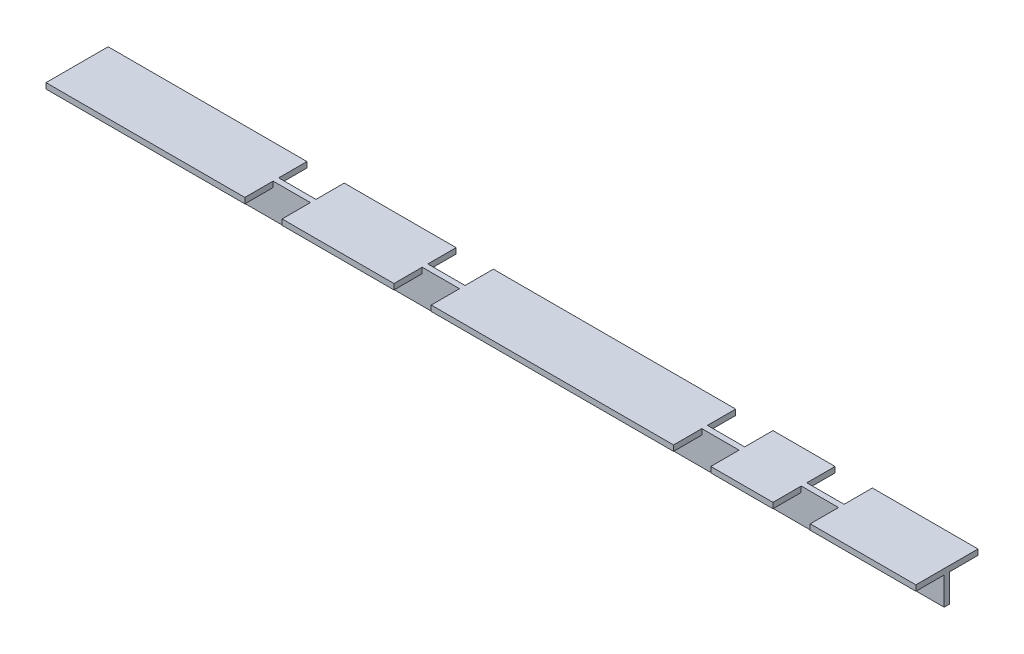
ISO-10303-21;
HEADER;
FILE_DESCRIPTION(('STEP AP214'),'2;1');
FILE_NAME('part.step','',(''),(''),'','','');
FILE_SCHEMA(('AUTOMOTIVE_DESIGN { 1 0 10303 214 1 1 1 1 }'));
ENDSEC;
DATA;
#1=APPLICATION_CONTEXT('core data for automotive mechanical design processes');
#2=APPLICATION_PROTOCOL_DEFINITION('international standard','automotive_design',2000,#1);
#3=PRODUCT_CONTEXT('',#1,'mechanical');
#4=PRODUCT('Part','Part','',(#3));
#5=PRODUCT_RELATED_PRODUCT_CATEGORY('part','',(#4));
#6=PRODUCT_DEFINITION_FORMATION('','',#4);
#7=PRODUCT_DEFINITION_CONTEXT('part definition',#1,'design');
#8=PRODUCT_DEFINITION('design','',#6,#7);
#9=PRODUCT_DEFINITION_SHAPE('','',#8);
#10=(LENGTH_UNIT() NAMED_UNIT(*) SI_UNIT(.MILLI.,.METRE.));
#11=(NAMED_UNIT(*) PLANE_ANGLE_UNIT() SI_UNIT($,.RADIAN.));
#12=(NAMED_UNIT(*) SI_UNIT($,.STERADIAN.) SOLID_ANGLE_UNIT());
#13=UNCERTAINTY_MEASURE_WITH_UNIT(LENGTH_MEASURE(1.E-05),#10,'distance_accuracy_value','');
#14=(GEOMETRIC_REPRESENTATION_CONTEXT(3) GLOBAL_UNCERTAINTY_ASSIGNED_CONTEXT((#13)) GLOBAL_UNIT_ASSIGNED_CONTEXT((#10,
#11,#12)) REPRESENTATION_CONTEXT('',''));
#15=CARTESIAN_POINT('',(0.,0.,0.));
#16=DIRECTION('',(0.,0.,1.));
#17=DIRECTION('',(1.,0.,0.));
#18=AXIS2_PLACEMENT_3D('',#15,#16,#17);
#19=CARTESIAN_POINT('',(1400.,0.,0.));
#20=DIRECTION('',(0.,0.,-1.));
#21=DIRECTION('',(-1.,0.,0.));
#22=AXIS2_PLACEMENT_3D('',#19,#20,#21);
#23=PLANE('',#22);
#24=DIRECTION('',(-1.,0.,0.));
#25=VECTOR('',#24,1.);
#26=CARTESIAN_POINT('',(1400.,0.,0.));
#27=LINE('',#26,#25);
#28=CARTESIAN_POINT('',(1010.,0.,0.));
#29=VERTEX_POINT('',#28);
#30=CARTESIAN_POINT('',(620.,0.,0.));
#31=VERTEX_POINT('',#30);
#32=EDGE_CURVE('E686',#29,#31,#27,.T.);
#33=ORIENTED_EDGE('',*,*,#32,.T.);
#34=DIRECTION('',(0.,-1.,0.));
#35=VECTOR('',#34,1.);
#36=CARTESIAN_POINT('',(620.,0.,0.));
#37=LINE('',#36,#35);
#38=CARTESIAN_POINT('',(620.,-9.,0.));
#39=VERTEX_POINT('',#38);
#40=EDGE_CURVE('E422',#31,#39,#37,.T.);
#41=ORIENTED_EDGE('',*,*,#40,.T.);
#42=DIRECTION('',(-1.,0.,0.));
#43=VECTOR('',#42,1.);
#44=CARTESIAN_POINT('',(1400.,-9.,0.));
#45=LINE('',#44,#43);
#46=CARTESIAN_POINT('',(1010.,-9.,0.));
#47=VERTEX_POINT('',#46);
#48=EDGE_CURVE('E679',#47,#39,#45,.T.);
#49=ORIENTED_EDGE('',*,*,#48,.F.);
#50=DIRECTION('',(0.,-1.,0.));
#51=VECTOR('',#50,1.);
#52=CARTESIAN_POINT('',(1010.,0.,0.));
#53=LINE('',#52,#51);
#54=EDGE_CURVE('E405',#29,#47,#53,.T.);
#55=ORIENTED_EDGE('',*,*,#54,.F.);
#56=EDGE_LOOP('',(#33,#41,#49,#55));
#57=FACE_BOUND('',#56,.T.);
#58=ADVANCED_FACE('F40',(#57),#23,.F.);
#59=CARTESIAN_POINT('',(1400.,0.,0.));
#60=VERTEX_POINT('',#59);
#61=CARTESIAN_POINT('',(1230.,0.,0.));
#62=VERTEX_POINT('',#61);
#63=EDGE_CURVE('E620',#60,#62,#27,.T.);
#64=ORIENTED_EDGE('',*,*,#63,.T.);
#65=DIRECTION('',(0.,-1.,0.));
#66=VECTOR('',#65,1.);
#67=CARTESIAN_POINT('',(1230.,0.,0.));
#68=LINE('',#67,#66);
#69=CARTESIAN_POINT('',(1230.,-9.,0.));
#70=VERTEX_POINT('',#69);
#71=EDGE_CURVE('E454',#62,#70,#68,.T.);
#72=ORIENTED_EDGE('',*,*,#71,.T.);
#73=CARTESIAN_POINT('',(1400.,-9.,0.));
#74=VERTEX_POINT('',#73);
#75=EDGE_CURVE('E11',#74,#70,#45,.T.);
#76=ORIENTED_EDGE('',*,*,#75,.F.);
#77=DIRECTION('',(0.,-1.,0.));
#78=VECTOR('',#77,1.);
#79=CARTESIAN_POINT('',(1400.,0.,0.));
#80=LINE('',#79,#78);
#81=EDGE_CURVE('E566',#60,#74,#80,.T.);
#82=ORIENTED_EDGE('',*,*,#81,.F.);
#83=EDGE_LOOP('',(#64,#72,#76,#82));
#84=FACE_BOUND('',#83,.T.);
#85=ADVANCED_FACE('F757',(#84),#23,.F.);
#86=CARTESIAN_POINT('',(1170.,-9.,0.));
#87=VERTEX_POINT('',#86);
#88=CARTESIAN_POINT('',(1070.,-9.,0.));
#89=VERTEX_POINT('',#88);
#90=EDGE_CURVE('E49',#87,#89,#45,.T.);
#91=ORIENTED_EDGE('',*,*,#90,.F.);
#92=DIRECTION('',(0.,-1.,0.));
#93=VECTOR('',#92,1.);
#94=CARTESIAN_POINT('',(1170.,0.,0.));
#95=LINE('',#94,#93);
#96=CARTESIAN_POINT('',(1170.,0.,0.));
#97=VERTEX_POINT('',#96);
#98=EDGE_CURVE('E467',#97,#87,#95,.T.);
#99=ORIENTED_EDGE('',*,*,#98,.F.);
#100=CARTESIAN_POINT('',(1070.,0.,0.));
#101=VERTEX_POINT('',#100);
#102=EDGE_CURVE('E625',#97,#101,#27,.T.);
#103=ORIENTED_EDGE('',*,*,#102,.T.);
#104=DIRECTION('',(0.,-1.,0.));
#105=VECTOR('',#104,1.);
#106=CARTESIAN_POINT('',(1070.,0.,0.));
#107=LINE('',#106,#105);
#108=EDGE_CURVE('E394',#101,#89,#107,.T.);
#109=ORIENTED_EDGE('',*,*,#108,.T.);
#110=EDGE_LOOP('',(#91,#99,#103,#109));
#111=FACE_BOUND('',#110,.T.);
#112=ADVANCED_FACE('F738',(#111),#23,.F.);
#113=CARTESIAN_POINT('',(560.,-9.,0.));
#114=VERTEX_POINT('',#113);
#115=CARTESIAN_POINT('',(380.,-9.,0.));
#116=VERTEX_POINT('',#115);
#117=EDGE_CURVE('E658',#114,#116,#45,.T.);
#118=ORIENTED_EDGE('',*,*,#117,.F.);
#119=DIRECTION('',(0.,-1.,0.));
#120=VECTOR('',#119,1.);
#121=CARTESIAN_POINT('',(560.,0.,0.));
#122=LINE('',#121,#120);
#123=CARTESIAN_POINT('',(560.,0.,0.));
#124=VERTEX_POINT('',#123);
#125=EDGE_CURVE('E437',#124,#114,#122,.T.);
#126=ORIENTED_EDGE('',*,*,#125,.F.);
#127=CARTESIAN_POINT('',(380.,0.,0.));
#128=VERTEX_POINT('',#127);
#129=EDGE_CURVE('E688',#124,#128,#27,.T.);
#130=ORIENTED_EDGE('',*,*,#129,.T.);
#131=DIRECTION('',(0.,-1.,0.));
#132=VECTOR('',#131,1.);
#133=CARTESIAN_POINT('',(380.,0.,0.));
#134=LINE('',#133,#132);
#135=EDGE_CURVE('E547',#128,#116,#134,.T.);
#136=ORIENTED_EDGE('',*,*,#135,.T.);
#137=EDGE_LOOP('',(#118,#126,#130,#136));
#138=FACE_BOUND('',#137,.T.);
#139=ADVANCED_FACE('F722',(#138),#23,.F.);
#140=CARTESIAN_POINT('',(1400.,-9.,0.));
#141=DIRECTION('',(0.,1.,0.));
#142=DIRECTION('',(0.,0.,1.));
#143=AXIS2_PLACEMENT_3D('',#140,#141,#142);
#144=PLANE('',#143);
#145=ORIENTED_EDGE('',*,*,#48,.T.);
#146=DIRECTION('',(0.,0.,1.));
#147=VECTOR('',#146,1.);
#148=CARTESIAN_POINT('',(620.,-8.99999999999998,-45.5));
#149=LINE('',#148,#147);
#150=CARTESIAN_POINT('',(620.,-8.99999999999998,-45.5));
#151=VERTEX_POINT('',#150);
#152=EDGE_CURVE('E423',#151,#39,#149,.T.);
#153=ORIENTED_EDGE('',*,*,#152,.F.);
#154=DIRECTION('',(-1.,0.,0.));
#155=VECTOR('',#154,1.);
#156=CARTESIAN_POINT('',(1400.,-8.99999999999998,-45.5));
#157=LINE('',#156,#155);
#158=CARTESIAN_POINT('',(1010.,-8.99999999999998,-45.5));
#159=VERTEX_POINT('',#158);
#160=EDGE_CURVE('E660',#159,#151,#157,.T.);
#161=ORIENTED_EDGE('',*,*,#160,.F.);
#162=DIRECTION('',(0.,0.,-1.));
#163=VECTOR('',#162,1.);
#164=CARTESIAN_POINT('',(1010.,-9.,0.));
#165=LINE('',#164,#163);
#166=EDGE_CURVE('E386',#47,#159,#165,.T.);
#167=ORIENTED_EDGE('',*,*,#166,.F.);
#168=EDGE_LOOP('',(#145,#153,#161,#167));
#169=FACE_BOUND('',#168,.T.);
#170=ADVANCED_FACE('F677',(#169),#144,.F.);
#171=ORIENTED_EDGE('',*,*,#75,.T.);
#172=DIRECTION('',(0.,0.,1.));
#173=VECTOR('',#172,1.);
#174=CARTESIAN_POINT('',(1230.,-8.99999999999998,-45.5));
#175=LINE('',#174,#173);
#176=CARTESIAN_POINT('',(1230.,-8.99999999999998,-45.5));
#177=VERTEX_POINT('',#176);
#178=EDGE_CURVE('E455',#177,#70,#175,.T.);
#179=ORIENTED_EDGE('',*,*,#178,.F.);
#180=CARTESIAN_POINT('',(1400.,-8.99999999999998,-45.5));
#181=VERTEX_POINT('',#180);
#182=EDGE_CURVE('E650',#181,#177,#157,.T.);
#183=ORIENTED_EDGE('',*,*,#182,.F.);
#184=DIRECTION('',(0.,0.,-1.));
#185=VECTOR('',#184,1.);
#186=CARTESIAN_POINT('',(1400.,-9.,0.));
#187=LINE('',#186,#185);
#188=EDGE_CURVE('E570',#74,#181,#187,.T.);
#189=ORIENTED_EDGE('',*,*,#188,.F.);
#190=EDGE_LOOP('',(#171,#179,#183,#189));
#191=FACE_BOUND('',#190,.T.);
#192=ADVANCED_FACE('F778',(#191),#144,.F.);
#193=CARTESIAN_POINT('',(1170.,-8.99999999999998,-45.5));
#194=VERTEX_POINT('',#193);
#195=CARTESIAN_POINT('',(1070.,-8.99999999999998,-45.5));
#196=VERTEX_POINT('',#195);
#197=EDGE_CURVE('E653',#194,#196,#157,.T.);
#198=ORIENTED_EDGE('',*,*,#197,.F.);
#199=DIRECTION('',(0.,0.,-1.));
#200=VECTOR('',#199,1.);
#201=CARTESIAN_POINT('',(1170.,-8.99999999999998,-45.5));
#202=LINE('',#201,#200);
#203=EDGE_CURVE('E448',#87,#194,#202,.T.);
#204=ORIENTED_EDGE('',*,*,#203,.F.);
#205=ORIENTED_EDGE('',*,*,#90,.T.);
#206=DIRECTION('',(0.,0.,1.));
#207=VECTOR('',#206,1.);
#208=CARTESIAN_POINT('',(1070.,-9.,0.));
#209=LINE('',#208,#207);
#210=EDGE_CURVE('E340',#196,#89,#209,.T.);
#211=ORIENTED_EDGE('',*,*,#210,.F.);
#212=EDGE_LOOP('',(#198,#204,#205,#211));
#213=FACE_BOUND('',#212,.T.);
#214=ADVANCED_FACE('F735',(#213),#144,.F.);
#215=CARTESIAN_POINT('',(560.,-8.99999999999998,-45.5));
#216=VERTEX_POINT('',#215);
#217=CARTESIAN_POINT('',(380.,-8.99999999999998,-45.5));
#218=VERTEX_POINT('',#217);
#219=EDGE_CURVE('E662',#216,#218,#157,.T.);
#220=ORIENTED_EDGE('',*,*,#219,.F.);
#221=DIRECTION('',(0.,0.,-1.));
#222=VECTOR('',#221,1.);
#223=CARTESIAN_POINT('',(560.,-8.99999999999998,-45.5));
#224=LINE('',#223,#222);
#225=EDGE_CURVE('E416',#114,#216,#224,.T.);
#226=ORIENTED_EDGE('',*,*,#225,.F.);
#227=ORIENTED_EDGE('',*,*,#117,.T.);
#228=DIRECTION('',(0.,0.,1.));
#229=VECTOR('',#228,1.);
#230=CARTESIAN_POINT('',(380.,-8.99999999999998,-45.5));
#231=LINE('',#230,#229);
#232=EDGE_CURVE('E433',#218,#116,#231,.T.);
#233=ORIENTED_EDGE('',*,*,#232,.F.);
#234=EDGE_LOOP('',(#220,#226,#227,#233));
#235=FACE_BOUND('',#234,.T.);
#236=ADVANCED_FACE('F725',(#235),#144,.F.);
#237=CARTESIAN_POINT('',(1400.,-8.99999999999998,-54.5));
#238=DIRECTION('',(0.,1.,0.));
#239=DIRECTION('',(0.,0.,1.));
#240=AXIS2_PLACEMENT_3D('',#237,#238,#239);
#241=PLANE('',#240);
#242=DIRECTION('',(-1.,0.,0.));
#243=VECTOR('',#242,1.);
#244=CARTESIAN_POINT('',(1400.,-8.99999999999998,-54.5));
#245=LINE('',#244,#243);
#246=CARTESIAN_POINT('',(1400.,-8.99999999999998,-54.5));
#247=VERTEX_POINT('',#246);
#248=CARTESIAN_POINT('',(1230.,-8.99999999999998,-54.5));
#249=VERTEX_POINT('',#248);
#250=EDGE_CURVE('E637',#247,#249,#245,.T.);
#251=ORIENTED_EDGE('',*,*,#250,.T.);
#252=DIRECTION('',(0.,0.,1.));
#253=VECTOR('',#252,1.);
#254=CARTESIAN_POINT('',(1230.,-8.99999999999996,-100.));
#255=LINE('',#254,#253);
#256=CARTESIAN_POINT('',(1230.,-8.99999999999996,-100.));
#257=VERTEX_POINT('',#256);
#258=EDGE_CURVE('E486',#257,#249,#255,.T.);
#259=ORIENTED_EDGE('',*,*,#258,.F.);
#260=DIRECTION('',(-1.,0.,0.));
#261=VECTOR('',#260,1.);
#262=CARTESIAN_POINT('',(1400.,-8.99999999999998,-100.));
#263=LINE('',#262,#261);
#264=CARTESIAN_POINT('',(1400.,-8.99999999999998,-100.));
#265=VERTEX_POINT('',#264);
#266=EDGE_CURVE('E631',#265,#257,#263,.T.);
#267=ORIENTED_EDGE('',*,*,#266,.F.);
#268=DIRECTION('',(0.,0.,-1.));
#269=VECTOR('',#268,1.);
#270=CARTESIAN_POINT('',(1400.,-8.99999999999998,-54.5));
#271=LINE('',#270,#269);
#272=EDGE_CURVE('E583',#247,#265,#271,.T.);
#273=ORIENTED_EDGE('',*,*,#272,.F.);
#274=EDGE_LOOP('',(#251,#259,#267,#273));
#275=FACE_BOUND('',#274,.T.);
#276=ADVANCED_FACE('F985',(#275),#241,.F.);
#277=CARTESIAN_POINT('',(1010.,-8.99999999999998,-54.5000000000002));
#278=VERTEX_POINT('',#277);
#279=CARTESIAN_POINT('',(620.,-8.99999999999998,-54.5000000000004));
#280=VERTEX_POINT('',#279);
#281=EDGE_CURVE('E1009',#278,#280,#245,.T.);
#282=ORIENTED_EDGE('',*,*,#281,.T.);
#283=DIRECTION('',(0.,0.,1.));
#284=VECTOR('',#283,1.);
#285=CARTESIAN_POINT('',(620.,-8.99999999999996,-100.));
#286=LINE('',#285,#284);
#287=CARTESIAN_POINT('',(620.,-8.99999999999996,-100.));
#288=VERTEX_POINT('',#287);
#289=EDGE_CURVE('E371',#288,#280,#286,.T.);
#290=ORIENTED_EDGE('',*,*,#289,.F.);
#291=CARTESIAN_POINT('',(1010.,-8.99999999999996,-100.));
#292=VERTEX_POINT('',#291);
#293=EDGE_CURVE('E1071',#292,#288,#263,.T.);
#294=ORIENTED_EDGE('',*,*,#293,.F.);
#295=DIRECTION('',(0.,0.,-1.));
#296=VECTOR('',#295,1.);
#297=CARTESIAN_POINT('',(1010.,-8.99999999999998,-54.5000000000002));
#298=LINE('',#297,#296);
#299=EDGE_CURVE('E328',#278,#292,#298,.T.);
#300=ORIENTED_EDGE('',*,*,#299,.F.);
#301=EDGE_LOOP('',(#282,#290,#294,#300));
#302=FACE_BOUND('',#301,.T.);
#303=ADVANCED_FACE('F1052',(#302),#241,.F.);
#304=CARTESIAN_POINT('',(1170.,-8.99999999999996,-100.));
#305=VERTEX_POINT('',#304);
#306=CARTESIAN_POINT('',(1070.,-8.99999999999996,-100.));
#307=VERTEX_POINT('',#306);
#308=EDGE_CURVE('E636',#305,#307,#263,.T.);
#309=ORIENTED_EDGE('',*,*,#308,.F.);
#310=DIRECTION('',(0.,0.,-1.));
#311=VECTOR('',#310,1.);
#312=CARTESIAN_POINT('',(1170.,-8.99999999999996,-100.));
#313=LINE('',#312,#311);
#314=CARTESIAN_POINT('',(1170.,-8.99999999999998,-54.5));
#315=VERTEX_POINT('',#314);
#316=EDGE_CURVE('E478',#315,#305,#313,.T.);
#317=ORIENTED_EDGE('',*,*,#316,.F.);
#318=CARTESIAN_POINT('',(1070.,-8.99999999999998,-54.5));
#319=VERTEX_POINT('',#318);
#320=EDGE_CURVE('E642',#315,#319,#245,.T.);
#321=ORIENTED_EDGE('',*,*,#320,.T.);
#322=DIRECTION('',(0.,0.,1.));
#323=VECTOR('',#322,1.);
#324=CARTESIAN_POINT('',(1070.,-8.99999999999998,-54.5));
#325=LINE('',#324,#323);
#326=EDGE_CURVE('E304',#307,#319,#325,.T.);
#327=ORIENTED_EDGE('',*,*,#326,.F.);
#328=EDGE_LOOP('',(#309,#317,#321,#327));
#329=FACE_BOUND('',#328,.T.);
#330=ADVANCED_FACE('F1023',(#329),#241,.F.);
#331=CARTESIAN_POINT('',(560.,-8.99999999999996,-100.));
#332=VERTEX_POINT('',#331);
#333=CARTESIAN_POINT('',(380.,-8.99999999999996,-100.));
#334=VERTEX_POINT('',#333);
#335=EDGE_CURVE('E1068',#332,#334,#263,.T.);
#336=ORIENTED_EDGE('',*,*,#335,.F.);
#337=DIRECTION('',(0.,0.,-1.));
#338=VECTOR('',#337,1.);
#339=CARTESIAN_POINT('',(560.,-8.99999999999996,-100.));
#340=LINE('',#339,#338);
#341=CARTESIAN_POINT('',(560.,-8.99999999999998,-54.5));
#342=VERTEX_POINT('',#341);
#343=EDGE_CURVE('E509',#342,#332,#340,.T.);
#344=ORIENTED_EDGE('',*,*,#343,.F.);
#345=CARTESIAN_POINT('',(380.,-8.99999999999998,-54.5000000000006));
#346=VERTEX_POINT('',#345);
#347=EDGE_CURVE('E1006',#342,#346,#245,.T.);
#348=ORIENTED_EDGE('',*,*,#347,.T.);
#349=DIRECTION('',(0.,0.,1.));
#350=VECTOR('',#349,1.);
#351=CARTESIAN_POINT('',(380.,-8.99999999999996,-100.));
#352=LINE('',#351,#350);
#353=EDGE_CURVE('E361',#334,#346,#352,.T.);
#354=ORIENTED_EDGE('',*,*,#353,.F.);
#355=EDGE_LOOP('',(#336,#344,#348,#354));
#356=FACE_BOUND('',#355,.T.);
#357=ADVANCED_FACE('F986',(#356),#241,.F.);
#358=CARTESIAN_POINT('',(1400.,0.,-100.));
#359=DIRECTION('',(0.,0.,1.));
#360=DIRECTION('',(1.,0.,0.));
#361=AXIS2_PLACEMENT_3D('',#358,#359,#360);
#362=PLANE('',#361);
#363=ORIENTED_EDGE('',*,*,#266,.T.);
#364=DIRECTION('',(0.,-1.,0.));
#365=VECTOR('',#364,1.);
#366=CARTESIAN_POINT('',(1230.,0.,-100.));
#367=LINE('',#366,#365);
#368=CARTESIAN_POINT('',(1230.,0.,-100.));
#369=VERTEX_POINT('',#368);
#370=EDGE_CURVE('E458',#369,#257,#367,.T.);
#371=ORIENTED_EDGE('',*,*,#370,.F.);
#372=DIRECTION('',(-1.,0.,0.));
#373=VECTOR('',#372,1.);
#374=CARTESIAN_POINT('',(1400.,0.,-100.));
#375=LINE('',#374,#373);
#376=CARTESIAN_POINT('',(1400.,0.,-100.));
#377=VERTEX_POINT('',#376);
#378=EDGE_CURVE('E626',#377,#369,#375,.T.);
#379=ORIENTED_EDGE('',*,*,#378,.F.);
#380=DIRECTION('',(0.,1.,0.));
#381=VECTOR('',#380,1.);
#382=CARTESIAN_POINT('',(1400.,0.,-100.));
#383=LINE('',#382,#381);
#384=EDGE_CURVE('E586',#265,#377,#383,.T.);
#385=ORIENTED_EDGE('',*,*,#384,.F.);
#386=EDGE_LOOP('',(#363,#371,#379,#385));
#387=FACE_BOUND('',#386,.T.);
#388=ADVANCED_FACE('F983',(#387),#362,.F.);
#389=ORIENTED_EDGE('',*,*,#293,.T.);
#390=DIRECTION('',(0.,-1.,0.));
#391=VECTOR('',#390,1.);
#392=CARTESIAN_POINT('',(620.,0.,-100.));
#393=LINE('',#392,#391);
#394=CARTESIAN_POINT('',(620.,0.,-100.));
#395=VERTEX_POINT('',#394);
#396=EDGE_CURVE('E490',#395,#288,#393,.T.);
#397=ORIENTED_EDGE('',*,*,#396,.F.);
#398=CARTESIAN_POINT('',(1010.,0.,-100.));
#399=VERTEX_POINT('',#398);
#400=EDGE_CURVE('E1081',#399,#395,#375,.T.);
#401=ORIENTED_EDGE('',*,*,#400,.F.);
#402=DIRECTION('',(0.,-1.,0.));
#403=VECTOR('',#402,1.);
#404=CARTESIAN_POINT('',(1010.,0.,-100.));
#405=LINE('',#404,#403);
#406=EDGE_CURVE('E341',#399,#292,#405,.T.);
#407=ORIENTED_EDGE('',*,*,#406,.T.);
#408=EDGE_LOOP('',(#389,#397,#401,#407));
#409=FACE_BOUND('',#408,.T.);
#410=ADVANCED_FACE('F1065',(#409),#362,.F.);
#411=CARTESIAN_POINT('',(1170.,0.,-100.));
#412=VERTEX_POINT('',#411);
#413=CARTESIAN_POINT('',(1070.,0.,-100.));
#414=VERTEX_POINT('',#413);
#415=EDGE_CURVE('E326',#412,#414,#375,.T.);
#416=ORIENTED_EDGE('',*,*,#415,.F.);
#417=DIRECTION('',(0.,-1.,0.));
#418=VECTOR('',#417,1.);
#419=CARTESIAN_POINT('',(1170.,0.,-100.));
#420=LINE('',#419,#418);
#421=EDGE_CURVE('E495',#412,#305,#420,.T.);
#422=ORIENTED_EDGE('',*,*,#421,.T.);
#423=ORIENTED_EDGE('',*,*,#308,.T.);
#424=DIRECTION('',(0.,-1.,0.));
#425=VECTOR('',#424,1.);
#426=CARTESIAN_POINT('',(1070.,0.,-100.));
#427=LINE('',#426,#425);
#428=EDGE_CURVE('E337',#414,#307,#427,.T.);
#429=ORIENTED_EDGE('',*,*,#428,.F.);
#430=EDGE_LOOP('',(#416,#422,#423,#429));
#431=FACE_BOUND('',#430,.T.);
#432=ADVANCED_FACE('F769',(#431),#362,.F.);
#433=CARTESIAN_POINT('',(560.,0.,-100.));
#434=VERTEX_POINT('',#433);
#435=CARTESIAN_POINT('',(380.,0.,-100.));
#436=VERTEX_POINT('',#435);
#437=EDGE_CURVE('E1079',#434,#436,#375,.T.);
#438=ORIENTED_EDGE('',*,*,#437,.F.);
#439=DIRECTION('',(0.,-1.,0.));
#440=VECTOR('',#439,1.);
#441=CARTESIAN_POINT('',(560.,0.,-100.));
#442=LINE('',#441,#440);
#443=EDGE_CURVE('E525',#434,#332,#442,.T.);
#444=ORIENTED_EDGE('',*,*,#443,.T.);
#445=ORIENTED_EDGE('',*,*,#335,.T.);
#446=DIRECTION('',(0.,-1.,0.));
#447=VECTOR('',#446,1.);
#448=CARTESIAN_POINT('',(380.,0.,-100.));
#449=LINE('',#448,#447);
#450=EDGE_CURVE('E368',#436,#334,#449,.T.);
#451=ORIENTED_EDGE('',*,*,#450,.F.);
#452=EDGE_LOOP('',(#438,#444,#445,#451));
#453=FACE_BOUND('',#452,.T.);
#454=ADVANCED_FACE('F764',(#453),#362,.F.);
#455=CARTESIAN_POINT('',(320.,-9.,0.));
#456=VERTEX_POINT('',#455);
#457=CARTESIAN_POINT('',(0.,-9.,0.));
#458=VERTEX_POINT('',#457);
#459=EDGE_CURVE('E50',#456,#458,#45,.T.);
#460=ORIENTED_EDGE('',*,*,#459,.F.);
#461=DIRECTION('',(0.,-1.,0.));
#462=VECTOR('',#461,1.);
#463=CARTESIAN_POINT('',(320.,0.,0.));
#464=LINE('',#463,#462);
#465=CARTESIAN_POINT('',(320.,0.,0.));
#466=VERTEX_POINT('',#465);
#467=EDGE_CURVE('E560',#466,#456,#464,.T.);
#468=ORIENTED_EDGE('',*,*,#467,.F.);
#469=CARTESIAN_POINT('',(0.,0.,0.));
#470=VERTEX_POINT('',#469);
#471=EDGE_CURVE('E592',#466,#470,#27,.T.);
#472=ORIENTED_EDGE('',*,*,#471,.T.);
#473=DIRECTION('',(0.,-1.,0.));
#474=VECTOR('',#473,1.);
#475=CARTESIAN_POINT('',(0.,0.,0.));
#476=LINE('',#475,#474);
#477=EDGE_CURVE('E556',#470,#458,#476,.T.);
#478=ORIENTED_EDGE('',*,*,#477,.T.);
#479=EDGE_LOOP('',(#460,#468,#472,#478));
#480=FACE_BOUND('',#479,.T.);
#481=ADVANCED_FACE('F42',(#480),#23,.F.);
#482=CARTESIAN_POINT('',(320.,-8.99999999999998,-45.5));
#483=VERTEX_POINT('',#482);
#484=CARTESIAN_POINT('',(0.,-8.99999999999998,-45.5));
#485=VERTEX_POINT('',#484);
#486=EDGE_CURVE('E649',#483,#485,#157,.T.);
#487=ORIENTED_EDGE('',*,*,#486,.F.);
#488=DIRECTION('',(0.,0.,-1.));
#489=VECTOR('',#488,1.);
#490=CARTESIAN_POINT('',(320.,-8.99999999999998,-45.5));
#491=LINE('',#490,#489);
#492=EDGE_CURVE('E539',#456,#483,#491,.T.);
#493=ORIENTED_EDGE('',*,*,#492,.F.);
#494=ORIENTED_EDGE('',*,*,#459,.T.);
#495=DIRECTION('',(0.,0.,-1.));
#496=VECTOR('',#495,1.);
#497=CARTESIAN_POINT('',(0.,-9.,0.));
#498=LINE('',#497,#496);
#499=EDGE_CURVE('E596',#458,#485,#498,.T.);
#500=ORIENTED_EDGE('',*,*,#499,.T.);
#501=EDGE_LOOP('',(#487,#493,#494,#500));
#502=FACE_BOUND('',#501,.T.);
#503=ADVANCED_FACE('F711',(#502),#144,.F.);
#504=CARTESIAN_POINT('',(1400.,-8.99999999999998,-45.5));
#505=DIRECTION('',(0.,0.,-1.));
#506=DIRECTION('',(-1.,0.,0.));
#507=AXIS2_PLACEMENT_3D('',#504,#505,#506);
#508=PLANE('',#507);
#509=DIRECTION('',(0.,-1.,0.));
#510=VECTOR('',#509,1.);
#511=CARTESIAN_POINT('',(0.,-8.99999999999998,-45.5));
#512=LINE('',#511,#510);
#513=CARTESIAN_POINT('',(0.,-54.,-45.5));
#514=VERTEX_POINT('',#513);
#515=EDGE_CURVE('E600',#485,#514,#512,.T.);
#516=ORIENTED_EDGE('',*,*,#515,.T.);
#517=DIRECTION('',(-1.,0.,0.));
#518=VECTOR('',#517,1.);
#519=CARTESIAN_POINT('',(1400.,-54.,-45.5));
#520=LINE('',#519,#518);
#521=CARTESIAN_POINT('',(1400.,-54.,-45.5));
#522=VERTEX_POINT('',#521);
#523=EDGE_CURVE('E646',#522,#514,#520,.T.);
#524=ORIENTED_EDGE('',*,*,#523,.F.);
#525=DIRECTION('',(0.,-1.,0.));
#526=VECTOR('',#525,1.);
#527=CARTESIAN_POINT('',(1400.,-8.99999999999998,-45.5));
#528=LINE('',#527,#526);
#529=EDGE_CURVE('E574',#181,#522,#528,.T.);
#530=ORIENTED_EDGE('',*,*,#529,.F.);
#531=ORIENTED_EDGE('',*,*,#182,.T.);
#532=DIRECTION('',(0.,-1.,0.));
#533=VECTOR('',#532,1.);
#534=CARTESIAN_POINT('',(1230.,0.,-45.5));
#535=LINE('',#534,#533);
#536=CARTESIAN_POINT('',(1230.,0.,-45.5));
#537=VERTEX_POINT('',#536);
#538=EDGE_CURVE('E426',#537,#177,#535,.T.);
#539=ORIENTED_EDGE('',*,*,#538,.F.);
#540=DIRECTION('',(1.,0.,0.));
#541=VECTOR('',#540,1.);
#542=CARTESIAN_POINT('',(1230.,0.,-45.5));
#543=LINE('',#542,#541);
#544=CARTESIAN_POINT('',(1170.,0.,-45.5));
#545=VERTEX_POINT('',#544);
#546=EDGE_CURVE('E64',#545,#537,#543,.T.);
#547=ORIENTED_EDGE('',*,*,#546,.F.);
#548=DIRECTION('',(0.,-1.,0.));
#549=VECTOR('',#548,1.);
#550=CARTESIAN_POINT('',(1170.,0.,-45.5));
#551=LINE('',#550,#549);
#552=EDGE_CURVE('E464',#545,#194,#551,.T.);
#553=ORIENTED_EDGE('',*,*,#552,.T.);
#554=ORIENTED_EDGE('',*,*,#197,.T.);
#555=DIRECTION('',(0.,-1.,0.));
#556=VECTOR('',#555,1.);
#557=CARTESIAN_POINT('',(1070.,0.,-45.5));
#558=LINE('',#557,#556);
#559=CARTESIAN_POINT('',(1070.,0.,-45.5));
#560=VERTEX_POINT('',#559);
#561=EDGE_CURVE('E365',#560,#196,#558,.T.);
#562=ORIENTED_EDGE('',*,*,#561,.F.);
#563=DIRECTION('',(1.,0.,0.));
#564=VECTOR('',#563,1.);
#565=CARTESIAN_POINT('',(1070.,0.,-45.5));
#566=LINE('',#565,#564);
#567=CARTESIAN_POINT('',(1010.,0.,-45.5));
#568=VERTEX_POINT('',#567);
#569=EDGE_CURVE('E390',#568,#560,#566,.T.);
#570=ORIENTED_EDGE('',*,*,#569,.F.);
#571=DIRECTION('',(0.,-1.,0.));
#572=VECTOR('',#571,1.);
#573=CARTESIAN_POINT('',(1010.,0.,-45.5));
#574=LINE('',#573,#572);
#575=EDGE_CURVE('E402',#568,#159,#574,.T.);
#576=ORIENTED_EDGE('',*,*,#575,.T.);
#577=ORIENTED_EDGE('',*,*,#160,.T.);
#578=DIRECTION('',(0.,-1.,0.));
#579=VECTOR('',#578,1.);
#580=CARTESIAN_POINT('',(620.,0.,-45.5));
#581=LINE('',#580,#579);
#582=CARTESIAN_POINT('',(620.,0.,-45.5));
#583=VERTEX_POINT('',#582);
#584=EDGE_CURVE('E430',#583,#151,#581,.T.);
#585=ORIENTED_EDGE('',*,*,#584,.F.);
#586=DIRECTION('',(1.,0.,0.));
#587=VECTOR('',#586,1.);
#588=CARTESIAN_POINT('',(620.,0.,-45.5));
#589=LINE('',#588,#587);
#590=CARTESIAN_POINT('',(560.,0.,-45.5));
#591=VERTEX_POINT('',#590);
#592=EDGE_CURVE('E57',#591,#583,#589,.T.);
#593=ORIENTED_EDGE('',*,*,#592,.F.);
#594=DIRECTION('',(0.,-1.,0.));
#595=VECTOR('',#594,1.);
#596=CARTESIAN_POINT('',(560.,0.,-45.5));
#597=LINE('',#596,#595);
#598=EDGE_CURVE('E434',#591,#216,#597,.T.);
#599=ORIENTED_EDGE('',*,*,#598,.T.);
#600=ORIENTED_EDGE('',*,*,#219,.T.);
#601=DIRECTION('',(0.,-1.,0.));
#602=VECTOR('',#601,1.);
#603=CARTESIAN_POINT('',(380.,0.,-45.5));
#604=LINE('',#603,#602);
#605=CARTESIAN_POINT('',(380.,0.,-45.5));
#606=VERTEX_POINT('',#605);
#607=EDGE_CURVE('E553',#606,#218,#604,.T.);
#608=ORIENTED_EDGE('',*,*,#607,.F.);
#609=DIRECTION('',(1.,0.,0.));
#610=VECTOR('',#609,1.);
#611=CARTESIAN_POINT('',(380.,0.,-45.5));
#612=LINE('',#611,#610);
#613=CARTESIAN_POINT('',(320.,0.,-45.5));
#614=VERTEX_POINT('',#613);
#615=EDGE_CURVE('E543',#614,#606,#612,.T.);
#616=ORIENTED_EDGE('',*,*,#615,.F.);
#617=DIRECTION('',(0.,-1.,0.));
#618=VECTOR('',#617,1.);
#619=CARTESIAN_POINT('',(320.,0.,-45.5));
#620=LINE('',#619,#618);
#621=EDGE_CURVE('E557',#614,#483,#620,.T.);
#622=ORIENTED_EDGE('',*,*,#621,.T.);
#623=ORIENTED_EDGE('',*,*,#486,.T.);
#624=EDGE_LOOP('',(#516,#524,#530,#531,#539,#547,#553,#554,#562,#570,#576,#577,#585,#593,#599,
#600,#608,#616,#622,#623));
#625=FACE_BOUND('',#624,.T.);
#626=ADVANCED_FACE('F670',(#625),#508,.F.);
#627=CARTESIAN_POINT('',(1400.,-54.,-45.5));
#628=DIRECTION('',(0.,1.,0.));
#629=DIRECTION('',(0.,0.,1.));
#630=AXIS2_PLACEMENT_3D('',#627,#628,#629);
#631=PLANE('',#630);
#632=DIRECTION('',(0.,0.,-1.));
#633=VECTOR('',#632,1.);
#634=CARTESIAN_POINT('',(0.,-54.,-45.5));
#635=LINE('',#634,#633);
#636=CARTESIAN_POINT('',(0.,-54.,-54.5));
#637=VERTEX_POINT('',#636);
#638=EDGE_CURVE('E603',#514,#637,#635,.T.);
#639=ORIENTED_EDGE('',*,*,#638,.T.);
#640=DIRECTION('',(-1.,0.,0.));
#641=VECTOR('',#640,1.);
#642=CARTESIAN_POINT('',(1400.,-54.,-54.5));
#643=LINE('',#642,#641);
#644=CARTESIAN_POINT('',(1400.,-54.,-54.5));
#645=VERTEX_POINT('',#644);
#646=EDGE_CURVE('E641',#645,#637,#643,.T.);
#647=ORIENTED_EDGE('',*,*,#646,.F.);
#648=DIRECTION('',(0.,0.,-1.));
#649=VECTOR('',#648,1.);
#650=CARTESIAN_POINT('',(1400.,-54.,-45.5));
#651=LINE('',#650,#649);
#652=EDGE_CURVE('E577',#522,#645,#651,.T.);
#653=ORIENTED_EDGE('',*,*,#652,.F.);
#654=ORIENTED_EDGE('',*,*,#523,.T.);
#655=EDGE_LOOP('',(#639,#647,#653,#654));
#656=FACE_BOUND('',#655,.T.);
#657=ADVANCED_FACE('F802',(#656),#631,.F.);
#658=CARTESIAN_POINT('',(1400.,-8.99999999999998,-54.5));
#659=DIRECTION('',(0.,0.,1.));
#660=DIRECTION('',(0.,-1.,0.));
#661=AXIS2_PLACEMENT_3D('',#658,#659,#660);
#662=PLANE('',#661);
#663=DIRECTION('',(0.,1.,0.));
#664=VECTOR('',#663,1.);
#665=CARTESIAN_POINT('',(0.,-8.99999999999998,-54.5));
#666=LINE('',#665,#664);
#667=CARTESIAN_POINT('',(0.,-8.99999999999998,-54.5));
#668=VERTEX_POINT('',#667);
#669=EDGE_CURVE('E606',#637,#668,#666,.T.);
#670=ORIENTED_EDGE('',*,*,#669,.T.);
#671=CARTESIAN_POINT('',(320.,-8.99999999999998,-54.5000000000006));
#672=VERTEX_POINT('',#671);
#673=EDGE_CURVE('E635',#672,#668,#245,.T.);
#674=ORIENTED_EDGE('',*,*,#673,.F.);
#675=DIRECTION('',(0.,-1.,0.));
#676=VECTOR('',#675,1.);
#677=CARTESIAN_POINT('',(320.,0.,-54.5000000000006));
#678=LINE('',#677,#676);
#679=CARTESIAN_POINT('',(320.,0.,-54.5000000000006));
#680=VERTEX_POINT('',#679);
#681=EDGE_CURVE('E376',#680,#672,#678,.T.);
#682=ORIENTED_EDGE('',*,*,#681,.F.);
#683=DIRECTION('',(-1.,0.,0.));
#684=VECTOR('',#683,1.);
#685=CARTESIAN_POINT('',(380.,0.,-54.5000000000006));
#686=LINE('',#685,#684);
#687=CARTESIAN_POINT('',(380.,0.,-54.5000000000006));
#688=VERTEX_POINT('',#687);
#689=EDGE_CURVE('E351',#688,#680,#686,.T.);
#690=ORIENTED_EDGE('',*,*,#689,.F.);
#691=DIRECTION('',(0.,-1.,0.));
#692=VECTOR('',#691,1.);
#693=CARTESIAN_POINT('',(380.,0.,-54.5000000000006));
#694=LINE('',#693,#692);
#695=EDGE_CURVE('E360',#688,#346,#694,.T.);
#696=ORIENTED_EDGE('',*,*,#695,.T.);
#697=ORIENTED_EDGE('',*,*,#347,.F.);
#698=DIRECTION('',(0.,-1.,0.));
#699=VECTOR('',#698,1.);
#700=CARTESIAN_POINT('',(560.,0.,-54.5));
#701=LINE('',#700,#699);
#702=CARTESIAN_POINT('',(560.,0.,-54.5));
#703=VERTEX_POINT('',#702);
#704=EDGE_CURVE('E529',#703,#342,#701,.T.);
#705=ORIENTED_EDGE('',*,*,#704,.F.);
#706=DIRECTION('',(-1.,0.,0.));
#707=VECTOR('',#706,1.);
#708=CARTESIAN_POINT('',(620.,0.,-54.5000000000004));
#709=LINE('',#708,#707);
#710=CARTESIAN_POINT('',(620.,0.,-54.5000000000004));
#711=VERTEX_POINT('',#710);
#712=EDGE_CURVE('E508',#711,#703,#709,.T.);
#713=ORIENTED_EDGE('',*,*,#712,.F.);
#714=DIRECTION('',(0.,-1.,0.));
#715=VECTOR('',#714,1.);
#716=CARTESIAN_POINT('',(620.,0.,-54.5000000000004));
#717=LINE('',#716,#715);
#718=EDGE_CURVE('E517',#711,#280,#717,.T.);
#719=ORIENTED_EDGE('',*,*,#718,.T.);
#720=ORIENTED_EDGE('',*,*,#281,.F.);
#721=DIRECTION('',(0.,-1.,0.));
#722=VECTOR('',#721,1.);
#723=CARTESIAN_POINT('',(1010.,0.,-54.5000000000002));
#724=LINE('',#723,#722);
#725=CARTESIAN_POINT('',(1010.,0.,-54.5000000000002));
#726=VERTEX_POINT('',#725);
#727=EDGE_CURVE('E309',#726,#278,#724,.T.);
#728=ORIENTED_EDGE('',*,*,#727,.F.);
#729=DIRECTION('',(-1.,0.,0.));
#730=VECTOR('',#729,1.);
#731=CARTESIAN_POINT('',(1070.,0.,-54.5));
#732=LINE('',#731,#730);
#733=CARTESIAN_POINT('',(1070.,0.,-54.5));
#734=VERTEX_POINT('',#733);
#735=EDGE_CURVE('E314',#734,#726,#732,.T.);
#736=ORIENTED_EDGE('',*,*,#735,.F.);
#737=DIRECTION('',(0.,-1.,0.));
#738=VECTOR('',#737,1.);
#739=CARTESIAN_POINT('',(1070.,0.,-54.5));
#740=LINE('',#739,#738);
#741=EDGE_CURVE('E297',#734,#319,#740,.T.);
#742=ORIENTED_EDGE('',*,*,#741,.T.);
#743=ORIENTED_EDGE('',*,*,#320,.F.);
#744=DIRECTION('',(0.,-1.,0.));
#745=VECTOR('',#744,1.);
#746=CARTESIAN_POINT('',(1170.,0.,-54.5));
#747=LINE('',#746,#745);
#748=CARTESIAN_POINT('',(1170.,0.,-54.5));
#749=VERTEX_POINT('',#748);
#750=EDGE_CURVE('E499',#749,#315,#747,.T.);
#751=ORIENTED_EDGE('',*,*,#750,.F.);
#752=DIRECTION('',(-1.,0.,0.));
#753=VECTOR('',#752,1.);
#754=CARTESIAN_POINT('',(1230.,0.,-54.5));
#755=LINE('',#754,#753);
#756=CARTESIAN_POINT('',(1230.,0.,-54.5));
#757=VERTEX_POINT('',#756);
#758=EDGE_CURVE('E477',#757,#749,#755,.T.);
#759=ORIENTED_EDGE('',*,*,#758,.F.);
#760=DIRECTION('',(0.,-1.,0.));
#761=VECTOR('',#760,1.);
#762=CARTESIAN_POINT('',(1230.,0.,-54.5));
#763=LINE('',#762,#761);
#764=EDGE_CURVE('E485',#757,#249,#763,.T.);
#765=ORIENTED_EDGE('',*,*,#764,.T.);
#766=ORIENTED_EDGE('',*,*,#250,.F.);
#767=DIRECTION('',(0.,1.,0.));
#768=VECTOR('',#767,1.);
#769=CARTESIAN_POINT('',(1400.,-8.99999999999998,-54.5));
#770=LINE('',#769,#768);
#771=EDGE_CURVE('E580',#645,#247,#770,.T.);
#772=ORIENTED_EDGE('',*,*,#771,.F.);
#773=ORIENTED_EDGE('',*,*,#646,.T.);
#774=EDGE_LOOP('',(#670,#674,#682,#690,#696,#697,#705,#713,#719,#720,#728,#736,#742,#743,#751,
#759,#765,#766,#772,#773));
#775=FACE_BOUND('',#774,.T.);
#776=ADVANCED_FACE('F316',(#775),#662,.F.);
#777=CARTESIAN_POINT('',(320.,-8.99999999999996,-100.));
#778=VERTEX_POINT('',#777);
#779=CARTESIAN_POINT('',(0.,-8.99999999999998,-100.));
#780=VERTEX_POINT('',#779);
#781=EDGE_CURVE('E630',#778,#780,#263,.T.);
#782=ORIENTED_EDGE('',*,*,#781,.F.);
#783=DIRECTION('',(0.,0.,-1.));
#784=VECTOR('',#783,1.);
#785=CARTESIAN_POINT('',(320.,-8.99999999999996,-100.));
#786=LINE('',#785,#784);
#787=EDGE_CURVE('E352',#672,#778,#786,.T.);
#788=ORIENTED_EDGE('',*,*,#787,.F.);
#789=ORIENTED_EDGE('',*,*,#673,.T.);
#790=DIRECTION('',(0.,0.,-1.));
#791=VECTOR('',#790,1.);
#792=CARTESIAN_POINT('',(0.,-8.99999999999998,-54.5));
#793=LINE('',#792,#791);
#794=EDGE_CURVE('E609',#668,#780,#793,.T.);
#795=ORIENTED_EDGE('',*,*,#794,.T.);
#796=EDGE_LOOP('',(#782,#788,#789,#795));
#797=FACE_BOUND('',#796,.T.);
#798=ADVANCED_FACE('F825',(#797),#241,.F.);
#799=CARTESIAN_POINT('',(320.,0.,-100.));
#800=VERTEX_POINT('',#799);
#801=CARTESIAN_POINT('',(0.,0.,-100.));
#802=VERTEX_POINT('',#801);
#803=EDGE_CURVE('E624',#800,#802,#375,.T.);
#804=ORIENTED_EDGE('',*,*,#803,.F.);
#805=DIRECTION('',(0.,-1.,0.));
#806=VECTOR('',#805,1.);
#807=CARTESIAN_POINT('',(320.,0.,-100.));
#808=LINE('',#807,#806);
#809=EDGE_CURVE('E372',#800,#778,#808,.T.);
#810=ORIENTED_EDGE('',*,*,#809,.T.);
#811=ORIENTED_EDGE('',*,*,#781,.T.);
#812=DIRECTION('',(0.,1.,0.));
#813=VECTOR('',#812,1.);
#814=CARTESIAN_POINT('',(0.,0.,-100.));
#815=LINE('',#814,#813);
#816=EDGE_CURVE('E613',#780,#802,#815,.T.);
#817=ORIENTED_EDGE('',*,*,#816,.T.);
#818=EDGE_LOOP('',(#804,#810,#811,#817));
#819=FACE_BOUND('',#818,.T.);
#820=ADVANCED_FACE('F772',(#819),#362,.F.);
#821=CARTESIAN_POINT('',(1400.,0.,0.));
#822=DIRECTION('',(0.,-1.,0.));
#823=DIRECTION('',(0.,0.,-1.));
#824=AXIS2_PLACEMENT_3D('',#821,#822,#823);
#825=PLANE('',#824);
#826=ORIENTED_EDGE('',*,*,#592,.T.);
#827=DIRECTION('',(0.,0.,1.));
#828=VECTOR('',#827,1.);
#829=CARTESIAN_POINT('',(620.,0.,-45.5));
#830=LINE('',#829,#828);
#831=EDGE_CURVE('E411',#583,#31,#830,.T.);
#832=ORIENTED_EDGE('',*,*,#831,.T.);
#833=ORIENTED_EDGE('',*,*,#32,.F.);
#834=DIRECTION('',(0.,0.,-1.));
#835=VECTOR('',#834,1.);
#836=CARTESIAN_POINT('',(1010.,0.,0.));
#837=LINE('',#836,#835);
#838=EDGE_CURVE('E385',#29,#568,#837,.T.);
#839=ORIENTED_EDGE('',*,*,#838,.T.);
#840=ORIENTED_EDGE('',*,*,#569,.T.);
#841=DIRECTION('',(0.,0.,1.));
#842=VECTOR('',#841,1.);
#843=CARTESIAN_POINT('',(1070.,0.,0.));
#844=LINE('',#843,#842);
#845=EDGE_CURVE('E381',#560,#101,#844,.T.);
#846=ORIENTED_EDGE('',*,*,#845,.T.);
#847=ORIENTED_EDGE('',*,*,#102,.F.);
#848=DIRECTION('',(0.,0.,-1.));
#849=VECTOR('',#848,1.);
#850=CARTESIAN_POINT('',(1170.,0.,-45.5));
#851=LINE('',#850,#849);
#852=EDGE_CURVE('E447',#97,#545,#851,.T.);
#853=ORIENTED_EDGE('',*,*,#852,.T.);
#854=ORIENTED_EDGE('',*,*,#546,.T.);
#855=DIRECTION('',(0.,0.,1.));
#856=VECTOR('',#855,1.);
#857=CARTESIAN_POINT('',(1230.,0.,-45.5));
#858=LINE('',#857,#856);
#859=EDGE_CURVE('E443',#537,#62,#858,.T.);
#860=ORIENTED_EDGE('',*,*,#859,.T.);
#861=ORIENTED_EDGE('',*,*,#63,.F.);
#862=DIRECTION('',(0.,0.,1.));
#863=VECTOR('',#862,1.);
#864=CARTESIAN_POINT('',(1400.,0.,0.));
#865=LINE('',#864,#863);
#866=EDGE_CURVE('E589',#377,#60,#865,.T.);
#867=ORIENTED_EDGE('',*,*,#866,.F.);
#868=ORIENTED_EDGE('',*,*,#378,.T.);
#869=DIRECTION('',(0.,0.,1.));
#870=VECTOR('',#869,1.);
#871=CARTESIAN_POINT('',(1230.,0.,-100.));
#872=LINE('',#871,#870);
#873=EDGE_CURVE('E473',#369,#757,#872,.T.);
#874=ORIENTED_EDGE('',*,*,#873,.T.);
#875=ORIENTED_EDGE('',*,*,#758,.T.);
#876=DIRECTION('',(0.,0.,-1.));
#877=VECTOR('',#876,1.);
#878=CARTESIAN_POINT('',(1170.,0.,-100.));
#879=LINE('',#878,#877);
#880=EDGE_CURVE('E482',#749,#412,#879,.T.);
#881=ORIENTED_EDGE('',*,*,#880,.T.);
#882=ORIENTED_EDGE('',*,*,#415,.T.);
#883=DIRECTION('',(0.,0.,1.));
#884=VECTOR('',#883,1.);
#885=CARTESIAN_POINT('',(1070.,0.,-54.5));
#886=LINE('',#885,#884);
#887=EDGE_CURVE('E301',#414,#734,#886,.T.);
#888=ORIENTED_EDGE('',*,*,#887,.T.);
#889=ORIENTED_EDGE('',*,*,#735,.T.);
#890=DIRECTION('',(0.,0.,-1.));
#891=VECTOR('',#890,1.);
#892=CARTESIAN_POINT('',(1010.,0.,-54.5000000000002));
#893=LINE('',#892,#891);
#894=EDGE_CURVE('E310',#726,#399,#893,.T.);
#895=ORIENTED_EDGE('',*,*,#894,.T.);
#896=ORIENTED_EDGE('',*,*,#400,.T.);
#897=DIRECTION('',(0.,0.,1.));
#898=VECTOR('',#897,1.);
#899=CARTESIAN_POINT('',(620.,0.,-100.));
#900=LINE('',#899,#898);
#901=EDGE_CURVE('E504',#395,#711,#900,.T.);
#902=ORIENTED_EDGE('',*,*,#901,.T.);
#903=ORIENTED_EDGE('',*,*,#712,.T.);
#904=DIRECTION('',(0.,0.,-1.));
#905=VECTOR('',#904,1.);
#906=CARTESIAN_POINT('',(560.,0.,-100.));
#907=LINE('',#906,#905);
#908=EDGE_CURVE('E513',#703,#434,#907,.T.);
#909=ORIENTED_EDGE('',*,*,#908,.T.);
#910=ORIENTED_EDGE('',*,*,#437,.T.);
#911=DIRECTION('',(0.,0.,1.));
#912=VECTOR('',#911,1.);
#913=CARTESIAN_POINT('',(380.,0.,-100.));
#914=LINE('',#913,#912);
#915=EDGE_CURVE('E347',#436,#688,#914,.T.);
#916=ORIENTED_EDGE('',*,*,#915,.T.);
#917=ORIENTED_EDGE('',*,*,#689,.T.);
#918=DIRECTION('',(0.,0.,-1.));
#919=VECTOR('',#918,1.);
#920=CARTESIAN_POINT('',(320.,0.,-100.));
#921=LINE('',#920,#919);
#922=EDGE_CURVE('E356',#680,#800,#921,.T.);
#923=ORIENTED_EDGE('',*,*,#922,.T.);
#924=ORIENTED_EDGE('',*,*,#803,.T.);
#925=DIRECTION('',(0.,0.,1.));
#926=VECTOR('',#925,1.);
#927=CARTESIAN_POINT('',(0.,0.,0.));
#928=LINE('',#927,#926);
#929=EDGE_CURVE('E571',#802,#470,#928,.T.);
#930=ORIENTED_EDGE('',*,*,#929,.T.);
#931=ORIENTED_EDGE('',*,*,#471,.F.);
#932=DIRECTION('',(0.,0.,-1.));
#933=VECTOR('',#932,1.);
#934=CARTESIAN_POINT('',(320.,0.,-45.5));
#935=LINE('',#934,#933);
#936=EDGE_CURVE('E538',#466,#614,#935,.T.);
#937=ORIENTED_EDGE('',*,*,#936,.T.);
#938=ORIENTED_EDGE('',*,*,#615,.T.);
#939=DIRECTION('',(0.,0.,1.));
#940=VECTOR('',#939,1.);
#941=CARTESIAN_POINT('',(380.,0.,-45.5));
#942=LINE('',#941,#940);
#943=EDGE_CURVE('E534',#606,#128,#942,.T.);
#944=ORIENTED_EDGE('',*,*,#943,.T.);
#945=ORIENTED_EDGE('',*,*,#129,.F.);
#946=DIRECTION('',(0.,0.,-1.));
#947=VECTOR('',#946,1.);
#948=CARTESIAN_POINT('',(560.,0.,-45.5));
#949=LINE('',#948,#947);
#950=EDGE_CURVE('E415',#124,#591,#949,.T.);
#951=ORIENTED_EDGE('',*,*,#950,.T.);
#952=EDGE_LOOP('',(#826,#832,#833,#839,#840,#846,#847,#853,#854,#860,#861,#867,#868,#874,#875,
#881,#882,#888,#889,#895,#896,#902,#903,#909,#910,#916,#917,#923,#924,#930,#931,#937,#938,#944,
#945,#951));
#953=FACE_BOUND('',#952,.T.);
#954=ADVANCED_FACE('F323',(#953),#825,.F.);
#955=CARTESIAN_POINT('',(1400.,0.,0.));
#956=DIRECTION('',(1.,0.,0.));
#957=DIRECTION('',(0.,0.,-1.));
#958=AXIS2_PLACEMENT_3D('',#955,#956,#957);
#959=PLANE('',#958);
#960=ORIENTED_EDGE('',*,*,#81,.T.);
#961=ORIENTED_EDGE('',*,*,#188,.T.);
#962=ORIENTED_EDGE('',*,*,#529,.T.);
#963=ORIENTED_EDGE('',*,*,#652,.T.);
#964=ORIENTED_EDGE('',*,*,#771,.T.);
#965=ORIENTED_EDGE('',*,*,#272,.T.);
#966=ORIENTED_EDGE('',*,*,#384,.T.);
#967=ORIENTED_EDGE('',*,*,#866,.T.);
#968=EDGE_LOOP('',(#960,#961,#962,#963,#964,#965,#966,#967));
#969=FACE_BOUND('',#968,.T.);
#970=ADVANCED_FACE('F974',(#969),#959,.T.);
#971=CARTESIAN_POINT('',(0.,0.,0.));
#972=DIRECTION('',(1.,0.,0.));
#973=DIRECTION('',(0.,0.,-1.));
#974=AXIS2_PLACEMENT_3D('',#971,#972,#973);
#975=PLANE('',#974);
#976=ORIENTED_EDGE('',*,*,#477,.F.);
#977=ORIENTED_EDGE('',*,*,#929,.F.);
#978=ORIENTED_EDGE('',*,*,#816,.F.);
#979=ORIENTED_EDGE('',*,*,#794,.F.);
#980=ORIENTED_EDGE('',*,*,#669,.F.);
#981=ORIENTED_EDGE('',*,*,#638,.F.);
#982=ORIENTED_EDGE('',*,*,#515,.F.);
#983=ORIENTED_EDGE('',*,*,#499,.F.);
#984=EDGE_LOOP('',(#976,#977,#978,#979,#980,#981,#982,#983));
#985=FACE_BOUND('',#984,.T.);
#986=ADVANCED_FACE('F707',(#985),#975,.F.);
#987=CARTESIAN_POINT('',(380.,0.,-45.5));
#988=DIRECTION('',(1.,0.,0.));
#989=DIRECTION('',(0.,0.,-1.));
#990=AXIS2_PLACEMENT_3D('',#987,#988,#989);
#991=PLANE('',#990);
#992=ORIENTED_EDGE('',*,*,#232,.T.);
#993=ORIENTED_EDGE('',*,*,#135,.F.);
#994=ORIENTED_EDGE('',*,*,#943,.F.);
#995=ORIENTED_EDGE('',*,*,#607,.T.);
#996=EDGE_LOOP('',(#992,#993,#994,#995));
#997=FACE_BOUND('',#996,.T.);
#998=ADVANCED_FACE('F719',(#997),#991,.F.);
#999=CARTESIAN_POINT('',(320.,0.,-45.5));
#1000=DIRECTION('',(-1.,0.,0.));
#1001=DIRECTION('',(0.,0.,1.));
#1002=AXIS2_PLACEMENT_3D('',#999,#1000,#1001);
#1003=PLANE('',#1002);
#1004=ORIENTED_EDGE('',*,*,#492,.T.);
#1005=ORIENTED_EDGE('',*,*,#621,.F.);
#1006=ORIENTED_EDGE('',*,*,#936,.F.);
#1007=ORIENTED_EDGE('',*,*,#467,.T.);
#1008=EDGE_LOOP('',(#1004,#1005,#1006,#1007));
#1009=FACE_BOUND('',#1008,.T.);
#1010=ADVANCED_FACE('F715',(#1009),#1003,.F.);
#1011=CARTESIAN_POINT('',(380.,0.,-100.));
#1012=DIRECTION('',(1.,0.,0.));
#1013=DIRECTION('',(0.,0.,-1.));
#1014=AXIS2_PLACEMENT_3D('',#1011,#1012,#1013);
#1015=PLANE('',#1014);
#1016=ORIENTED_EDGE('',*,*,#353,.T.);
#1017=ORIENTED_EDGE('',*,*,#695,.F.);
#1018=ORIENTED_EDGE('',*,*,#915,.F.);
#1019=ORIENTED_EDGE('',*,*,#450,.T.);
#1020=EDGE_LOOP('',(#1016,#1017,#1018,#1019));
#1021=FACE_BOUND('',#1020,.T.);
#1022=ADVANCED_FACE('F854',(#1021),#1015,.F.);
#1023=CARTESIAN_POINT('',(320.,0.,-100.));
#1024=DIRECTION('',(-1.,0.,0.));
#1025=DIRECTION('',(0.,0.,1.));
#1026=AXIS2_PLACEMENT_3D('',#1023,#1024,#1025);
#1027=PLANE('',#1026);
#1028=ORIENTED_EDGE('',*,*,#787,.T.);
#1029=ORIENTED_EDGE('',*,*,#809,.F.);
#1030=ORIENTED_EDGE('',*,*,#922,.F.);
#1031=ORIENTED_EDGE('',*,*,#681,.T.);
#1032=EDGE_LOOP('',(#1028,#1029,#1030,#1031));
#1033=FACE_BOUND('',#1032,.T.);
#1034=ADVANCED_FACE('F753',(#1033),#1027,.F.);
#1035=CARTESIAN_POINT('',(1070.,0.,0.));
#1036=DIRECTION('',(1.,0.,0.));
#1037=DIRECTION('',(0.,0.,-1.));
#1038=AXIS2_PLACEMENT_3D('',#1035,#1036,#1037);
#1039=PLANE('',#1038);
#1040=ORIENTED_EDGE('',*,*,#210,.T.);
#1041=ORIENTED_EDGE('',*,*,#108,.F.);
#1042=ORIENTED_EDGE('',*,*,#845,.F.);
#1043=ORIENTED_EDGE('',*,*,#561,.T.);
#1044=EDGE_LOOP('',(#1040,#1041,#1042,#1043));
#1045=FACE_BOUND('',#1044,.T.);
#1046=ADVANCED_FACE('F742',(#1045),#1039,.F.);
#1047=CARTESIAN_POINT('',(1010.,0.,0.));
#1048=DIRECTION('',(-1.,0.,0.));
#1049=DIRECTION('',(0.,0.,1.));
#1050=AXIS2_PLACEMENT_3D('',#1047,#1048,#1049);
#1051=PLANE('',#1050);
#1052=ORIENTED_EDGE('',*,*,#166,.T.);
#1053=ORIENTED_EDGE('',*,*,#575,.F.);
#1054=ORIENTED_EDGE('',*,*,#838,.F.);
#1055=ORIENTED_EDGE('',*,*,#54,.T.);
#1056=EDGE_LOOP('',(#1052,#1053,#1054,#1055));
#1057=FACE_BOUND('',#1056,.T.);
#1058=ADVANCED_FACE('F744',(#1057),#1051,.F.);
#1059=CARTESIAN_POINT('',(1070.,0.,-54.5));
#1060=DIRECTION('',(1.,0.,0.));
#1061=DIRECTION('',(0.,0.,-1.));
#1062=AXIS2_PLACEMENT_3D('',#1059,#1060,#1061);
#1063=PLANE('',#1062);
#1064=ORIENTED_EDGE('',*,*,#326,.T.);
#1065=ORIENTED_EDGE('',*,*,#741,.F.);
#1066=ORIENTED_EDGE('',*,*,#887,.F.);
#1067=ORIENTED_EDGE('',*,*,#428,.T.);
#1068=EDGE_LOOP('',(#1064,#1065,#1066,#1067));
#1069=FACE_BOUND('',#1068,.T.);
#1070=ADVANCED_FACE('F299',(#1069),#1063,.F.);
#1071=CARTESIAN_POINT('',(1010.,0.,-54.5000000000002));
#1072=DIRECTION('',(-1.,0.,0.));
#1073=DIRECTION('',(0.,0.,1.));
#1074=AXIS2_PLACEMENT_3D('',#1071,#1072,#1073);
#1075=PLANE('',#1074);
#1076=ORIENTED_EDGE('',*,*,#299,.T.);
#1077=ORIENTED_EDGE('',*,*,#406,.F.);
#1078=ORIENTED_EDGE('',*,*,#894,.F.);
#1079=ORIENTED_EDGE('',*,*,#727,.T.);
#1080=EDGE_LOOP('',(#1076,#1077,#1078,#1079));
#1081=FACE_BOUND('',#1080,.T.);
#1082=ADVANCED_FACE('F751',(#1081),#1075,.F.);
#1083=CARTESIAN_POINT('',(620.,0.,-100.));
#1084=DIRECTION('',(1.,0.,0.));
#1085=DIRECTION('',(0.,0.,-1.));
#1086=AXIS2_PLACEMENT_3D('',#1083,#1084,#1085);
#1087=PLANE('',#1086);
#1088=ORIENTED_EDGE('',*,*,#289,.T.);
#1089=ORIENTED_EDGE('',*,*,#718,.F.);
#1090=ORIENTED_EDGE('',*,*,#901,.F.);
#1091=ORIENTED_EDGE('',*,*,#396,.T.);
#1092=EDGE_LOOP('',(#1088,#1089,#1090,#1091));
#1093=FACE_BOUND('',#1092,.T.);
#1094=ADVANCED_FACE('F891',(#1093),#1087,.F.);
#1095=CARTESIAN_POINT('',(560.,0.,-100.));
#1096=DIRECTION('',(-1.,0.,0.));
#1097=DIRECTION('',(0.,0.,1.));
#1098=AXIS2_PLACEMENT_3D('',#1095,#1096,#1097);
#1099=PLANE('',#1098);
#1100=ORIENTED_EDGE('',*,*,#343,.T.);
#1101=ORIENTED_EDGE('',*,*,#443,.F.);
#1102=ORIENTED_EDGE('',*,*,#908,.F.);
#1103=ORIENTED_EDGE('',*,*,#704,.T.);
#1104=EDGE_LOOP('',(#1100,#1101,#1102,#1103));
#1105=FACE_BOUND('',#1104,.T.);
#1106=ADVANCED_FACE('F900',(#1105),#1099,.F.);
#1107=CARTESIAN_POINT('',(1230.,0.,-100.));
#1108=DIRECTION('',(1.,0.,0.));
#1109=DIRECTION('',(0.,0.,-1.));
#1110=AXIS2_PLACEMENT_3D('',#1107,#1108,#1109);
#1111=PLANE('',#1110);
#1112=ORIENTED_EDGE('',*,*,#258,.T.);
#1113=ORIENTED_EDGE('',*,*,#764,.F.);
#1114=ORIENTED_EDGE('',*,*,#873,.F.);
#1115=ORIENTED_EDGE('',*,*,#370,.T.);
#1116=EDGE_LOOP('',(#1112,#1113,#1114,#1115));
#1117=FACE_BOUND('',#1116,.T.);
#1118=ADVANCED_FACE('F909',(#1117),#1111,.F.);
#1119=CARTESIAN_POINT('',(1170.,0.,-100.));
#1120=DIRECTION('',(-1.,0.,0.));
#1121=DIRECTION('',(0.,0.,1.));
#1122=AXIS2_PLACEMENT_3D('',#1119,#1120,#1121);
#1123=PLANE('',#1122);
#1124=ORIENTED_EDGE('',*,*,#316,.T.);
#1125=ORIENTED_EDGE('',*,*,#421,.F.);
#1126=ORIENTED_EDGE('',*,*,#880,.F.);
#1127=ORIENTED_EDGE('',*,*,#750,.T.);
#1128=EDGE_LOOP('',(#1124,#1125,#1126,#1127));
#1129=FACE_BOUND('',#1128,.T.);
#1130=ADVANCED_FACE('F918',(#1129),#1123,.F.);
#1131=CARTESIAN_POINT('',(1230.,0.,-45.5));
#1132=DIRECTION('',(1.,0.,0.));
#1133=DIRECTION('',(0.,0.,-1.));
#1134=AXIS2_PLACEMENT_3D('',#1131,#1132,#1133);
#1135=PLANE('',#1134);
#1136=ORIENTED_EDGE('',*,*,#178,.T.);
#1137=ORIENTED_EDGE('',*,*,#71,.F.);
#1138=ORIENTED_EDGE('',*,*,#859,.F.);
#1139=ORIENTED_EDGE('',*,*,#538,.T.);
#1140=EDGE_LOOP('',(#1136,#1137,#1138,#1139));
#1141=FACE_BOUND('',#1140,.T.);
#1142=ADVANCED_FACE('F927',(#1141),#1135,.F.);
#1143=CARTESIAN_POINT('',(1170.,0.,-45.5));
#1144=DIRECTION('',(-1.,0.,0.));
#1145=DIRECTION('',(0.,0.,1.));
#1146=AXIS2_PLACEMENT_3D('',#1143,#1144,#1145);
#1147=PLANE('',#1146);
#1148=ORIENTED_EDGE('',*,*,#203,.T.);
#1149=ORIENTED_EDGE('',*,*,#552,.F.);
#1150=ORIENTED_EDGE('',*,*,#852,.F.);
#1151=ORIENTED_EDGE('',*,*,#98,.T.);
#1152=EDGE_LOOP('',(#1148,#1149,#1150,#1151));
#1153=FACE_BOUND('',#1152,.T.);
#1154=ADVANCED_FACE('F936',(#1153),#1147,.F.);
#1155=CARTESIAN_POINT('',(620.,0.,-45.5));
#1156=DIRECTION('',(1.,0.,0.));
#1157=DIRECTION('',(0.,0.,-1.));
#1158=AXIS2_PLACEMENT_3D('',#1155,#1156,#1157);
#1159=PLANE('',#1158);
#1160=ORIENTED_EDGE('',*,*,#152,.T.);
#1161=ORIENTED_EDGE('',*,*,#40,.F.);
#1162=ORIENTED_EDGE('',*,*,#831,.F.);
#1163=ORIENTED_EDGE('',*,*,#584,.T.);
#1164=EDGE_LOOP('',(#1160,#1161,#1162,#1163));
#1165=FACE_BOUND('',#1164,.T.);
#1166=ADVANCED_FACE('F681',(#1165),#1159,.F.);
#1167=CARTESIAN_POINT('',(560.,0.,-45.5));
#1168=DIRECTION('',(-1.,0.,0.));
#1169=DIRECTION('',(0.,0.,1.));
#1170=AXIS2_PLACEMENT_3D('',#1167,#1168,#1169);
#1171=PLANE('',#1170);
#1172=ORIENTED_EDGE('',*,*,#225,.T.);
#1173=ORIENTED_EDGE('',*,*,#598,.F.);
#1174=ORIENTED_EDGE('',*,*,#950,.F.);
#1175=ORIENTED_EDGE('',*,*,#125,.T.);
#1176=EDGE_LOOP('',(#1172,#1173,#1174,#1175));
#1177=FACE_BOUND('',#1176,.T.);
#1178=ADVANCED_FACE('F953',(#1177),#1171,.F.);
#1179=CLOSED_SHELL('',(#58,#85,#112,#139,#170,#192,#214,#236,#276,#303,#330,#357,#388,#410,#432,
#454,#481,#503,#626,#657,#776,#798,#820,#954,#970,#986,#998,#1010,#1022,#1034,#1046,#1058,#1070,
#1082,#1094,#1106,#1118,#1130,#1142,#1154,#1166,#1178));
#1180=MANIFOLD_SOLID_BREP('B2',#1179);
#1181=ADVANCED_BREP_SHAPE_REPRESENTATION('',(#18,#1180),#14);
#1182=SHAPE_DEFINITION_REPRESENTATION(#9,#1181);
ENDSEC;
END-ISO-10303-21;
